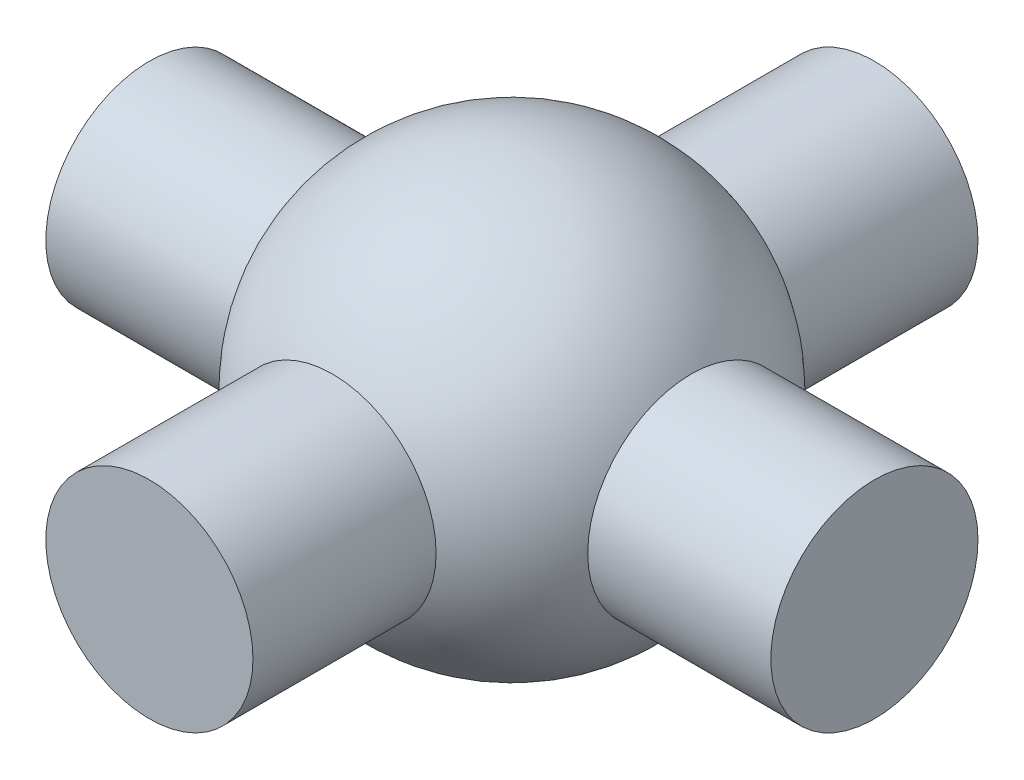
ISO-10303-21;
HEADER;
FILE_DESCRIPTION(('STEP AP214'),'2;1');
FILE_NAME('part.step','',(''),(''),'','','');
FILE_SCHEMA(('AUTOMOTIVE_DESIGN { 1 0 10303 214 1 1 1 1 }'));
ENDSEC;
DATA;
#1=APPLICATION_CONTEXT('core data for automotive mechanical design processes');
#2=APPLICATION_PROTOCOL_DEFINITION('international standard','automotive_design',2000,#1);
#3=PRODUCT_CONTEXT('',#1,'mechanical');
#4=PRODUCT('Part','Part','',(#3));
#5=PRODUCT_RELATED_PRODUCT_CATEGORY('part','',(#4));
#6=PRODUCT_DEFINITION_FORMATION('','',#4);
#7=PRODUCT_DEFINITION_CONTEXT('part definition',#1,'design');
#8=PRODUCT_DEFINITION('design','',#6,#7);
#9=PRODUCT_DEFINITION_SHAPE('','',#8);
#10=(LENGTH_UNIT() NAMED_UNIT(*) SI_UNIT(.MILLI.,.METRE.));
#11=(NAMED_UNIT(*) PLANE_ANGLE_UNIT() SI_UNIT($,.RADIAN.));
#12=(NAMED_UNIT(*) SI_UNIT($,.STERADIAN.) SOLID_ANGLE_UNIT());
#13=UNCERTAINTY_MEASURE_WITH_UNIT(LENGTH_MEASURE(1.E-05),#10,'distance_accuracy_value','');
#14=(GEOMETRIC_REPRESENTATION_CONTEXT(3) GLOBAL_UNCERTAINTY_ASSIGNED_CONTEXT((#13)) GLOBAL_UNIT_ASSIGNED_CONTEXT((#10,
#11,#12)) REPRESENTATION_CONTEXT('',''));
#15=CARTESIAN_POINT('',(0.,0.,0.));
#16=DIRECTION('',(0.,0.,1.));
#17=DIRECTION('',(1.,0.,0.));
#18=AXIS2_PLACEMENT_3D('',#15,#16,#17);
#19=CARTESIAN_POINT('',(0.,0.,0.));
#20=DIRECTION('',(0.,0.,-1.));
#21=DIRECTION('',(1.,0.,0.));
#22=AXIS2_PLACEMENT_3D('',#19,#20,#21);
#23=SPHERICAL_SURFACE('',#22,20.);
#24=CARTESIAN_POINT('',(0.,0.,17.3205080756888));
#25=DIRECTION('',(0.,0.,-1.));
#26=DIRECTION('',(-1.,0.,0.));
#27=AXIS2_PLACEMENT_3D('',#24,#25,#26);
#28=CIRCLE('',#27,10.);
#29=CARTESIAN_POINT('',(-10.,0.,17.3205080756888));
#30=VERTEX_POINT('',#29);
#31=EDGE_CURVE('E49',#30,#30,#28,.T.);
#32=ORIENTED_EDGE('',*,*,#31,.T.);
#33=EDGE_LOOP('',(#32));
#34=FACE_BOUND('',#33,.T.);
#35=CARTESIAN_POINT('',(17.3205080756888,0.,0.));
#36=DIRECTION('',(-1.,0.,0.));
#37=DIRECTION('',(0.,0.,1.));
#38=AXIS2_PLACEMENT_3D('',#35,#36,#37);
#39=CIRCLE('',#38,10.);
#40=CARTESIAN_POINT('',(17.3205080756888,0.,10.));
#41=VERTEX_POINT('',#40);
#42=EDGE_CURVE('E41',#41,#41,#39,.T.);
#43=ORIENTED_EDGE('',*,*,#42,.T.);
#44=EDGE_LOOP('',(#43));
#45=FACE_BOUND('',#44,.T.);
#46=CARTESIAN_POINT('',(-17.3205080756888,0.,0.));
#47=DIRECTION('',(1.,0.,0.));
#48=DIRECTION('',(0.,0.,-1.));
#49=AXIS2_PLACEMENT_3D('',#46,#47,#48);
#50=CIRCLE('',#49,10.);
#51=CARTESIAN_POINT('',(-17.3205080756888,0.,-10.));
#52=VERTEX_POINT('',#51);
#53=EDGE_CURVE('E10',#52,#52,#50,.T.);
#54=ORIENTED_EDGE('',*,*,#53,.T.);
#55=EDGE_LOOP('',(#54));
#56=FACE_BOUND('',#55,.T.);
#57=CARTESIAN_POINT('',(0.,0.,-17.3205080756888));
#58=DIRECTION('',(0.,0.,1.));
#59=DIRECTION('',(1.,0.,0.));
#60=AXIS2_PLACEMENT_3D('',#57,#58,#59);
#61=CIRCLE('',#60,10.);
#62=CARTESIAN_POINT('',(10.,0.,-17.3205080756888));
#63=VERTEX_POINT('',#62);
#64=EDGE_CURVE('E37',#63,#63,#61,.T.);
#65=ORIENTED_EDGE('',*,*,#64,.T.);
#66=EDGE_LOOP('',(#65));
#67=FACE_BOUND('',#66,.T.);
#68=ADVANCED_FACE('F34',(#34,#45,#56,#67),#23,.T.);
#69=CARTESIAN_POINT('',(35.,0.,0.));
#70=DIRECTION('',(-1.,0.,0.));
#71=DIRECTION('',(0.,0.,1.));
#72=AXIS2_PLACEMENT_3D('',#69,#70,#71);
#73=CYLINDRICAL_SURFACE('',#72,10.);
#74=ORIENTED_EDGE('',*,*,#53,.F.);
#75=EDGE_LOOP('',(#74));
#76=FACE_BOUND('',#75,.T.);
#77=CARTESIAN_POINT('',(-35.,0.,0.));
#78=DIRECTION('',(1.,0.,0.));
#79=DIRECTION('',(0.,0.,-1.));
#80=AXIS2_PLACEMENT_3D('',#77,#78,#79);
#81=CIRCLE('',#80,10.);
#82=CARTESIAN_POINT('',(-35.,0.,-10.));
#83=VERTEX_POINT('',#82);
#84=EDGE_CURVE('E55',#83,#83,#81,.T.);
#85=ORIENTED_EDGE('',*,*,#84,.T.);
#86=EDGE_LOOP('',(#85));
#87=FACE_BOUND('',#86,.T.);
#88=ADVANCED_FACE('F68',(#76,#87),#73,.T.);
#89=CARTESIAN_POINT('',(-35.,0.,0.));
#90=DIRECTION('',(1.,0.,0.));
#91=DIRECTION('',(0.,0.,-1.));
#92=AXIS2_PLACEMENT_3D('',#89,#90,#91);
#93=PLANE('',#92);
#94=ORIENTED_EDGE('',*,*,#84,.F.);
#95=EDGE_LOOP('',(#94));
#96=FACE_BOUND('',#95,.T.);
#97=ADVANCED_FACE('F70',(#96),#93,.F.);
#98=CARTESIAN_POINT('',(35.,0.,0.));
#99=DIRECTION('',(1.,0.,0.));
#100=DIRECTION('',(0.,0.,-1.));
#101=AXIS2_PLACEMENT_3D('',#98,#99,#100);
#102=PLANE('',#101);
#103=CARTESIAN_POINT('',(35.,0.,0.));
#104=DIRECTION('',(1.,0.,0.));
#105=DIRECTION('',(0.,0.,-1.));
#106=AXIS2_PLACEMENT_3D('',#103,#104,#105);
#107=CIRCLE('',#106,10.);
#108=CARTESIAN_POINT('',(35.,0.,-10.));
#109=VERTEX_POINT('',#108);
#110=EDGE_CURVE('E46',#109,#109,#107,.T.);
#111=ORIENTED_EDGE('',*,*,#110,.T.);
#112=EDGE_LOOP('',(#111));
#113=FACE_BOUND('',#112,.T.);
#114=ADVANCED_FACE('F72',(#113),#102,.T.);
#115=ORIENTED_EDGE('',*,*,#42,.F.);
#116=EDGE_LOOP('',(#115));
#117=FACE_BOUND('',#116,.T.);
#118=ORIENTED_EDGE('',*,*,#110,.F.);
#119=EDGE_LOOP('',(#118));
#120=FACE_BOUND('',#119,.T.);
#121=ADVANCED_FACE('F78',(#117,#120),#73,.T.);
#122=CARTESIAN_POINT('',(0.,0.,35.));
#123=DIRECTION('',(0.,0.,1.));
#124=DIRECTION('',(1.,0.,0.));
#125=AXIS2_PLACEMENT_3D('',#122,#123,#124);
#126=PLANE('',#125);
#127=CARTESIAN_POINT('',(0.,0.,35.));
#128=DIRECTION('',(0.,0.,1.));
#129=DIRECTION('',(1.,0.,0.));
#130=AXIS2_PLACEMENT_3D('',#127,#128,#129);
#131=CIRCLE('',#130,10.);
#132=CARTESIAN_POINT('',(10.,0.,35.));
#133=VERTEX_POINT('',#132);
#134=EDGE_CURVE('E51',#133,#133,#131,.T.);
#135=ORIENTED_EDGE('',*,*,#134,.T.);
#136=EDGE_LOOP('',(#135));
#137=FACE_BOUND('',#136,.T.);
#138=ADVANCED_FACE('F103',(#137),#126,.T.);
#139=CARTESIAN_POINT('',(0.,0.,35.));
#140=DIRECTION('',(0.,0.,-1.));
#141=DIRECTION('',(-1.,0.,0.));
#142=AXIS2_PLACEMENT_3D('',#139,#140,#141);
#143=CYLINDRICAL_SURFACE('',#142,10.);
#144=ORIENTED_EDGE('',*,*,#31,.F.);
#145=EDGE_LOOP('',(#144));
#146=FACE_BOUND('',#145,.T.);
#147=ORIENTED_EDGE('',*,*,#134,.F.);
#148=EDGE_LOOP('',(#147));
#149=FACE_BOUND('',#148,.T.);
#150=ADVANCED_FACE('F94',(#146,#149),#143,.T.);
#151=ORIENTED_EDGE('',*,*,#64,.F.);
#152=EDGE_LOOP('',(#151));
#153=FACE_BOUND('',#152,.T.);
#154=CARTESIAN_POINT('',(0.,0.,-35.));
#155=DIRECTION('',(0.,0.,1.));
#156=DIRECTION('',(1.,0.,0.));
#157=AXIS2_PLACEMENT_3D('',#154,#155,#156);
#158=CIRCLE('',#157,10.);
#159=CARTESIAN_POINT('',(10.,0.,-35.));
#160=VERTEX_POINT('',#159);
#161=EDGE_CURVE('E57',#160,#160,#158,.T.);
#162=ORIENTED_EDGE('',*,*,#161,.T.);
#163=EDGE_LOOP('',(#162));
#164=FACE_BOUND('',#163,.T.);
#165=ADVANCED_FACE('F90',(#153,#164),#143,.T.);
#166=CARTESIAN_POINT('',(0.,0.,-35.));
#167=DIRECTION('',(0.,0.,1.));
#168=DIRECTION('',(1.,0.,0.));
#169=AXIS2_PLACEMENT_3D('',#166,#167,#168);
#170=PLANE('',#169);
#171=ORIENTED_EDGE('',*,*,#161,.F.);
#172=EDGE_LOOP('',(#171));
#173=FACE_BOUND('',#172,.T.);
#174=ADVANCED_FACE('F93',(#173),#170,.F.);
#175=CLOSED_SHELL('',(#68,#88,#97,#114,#121,#138,#150,#165,#174));
#176=MANIFOLD_SOLID_BREP('B2',#175);
#177=ADVANCED_BREP_SHAPE_REPRESENTATION('',(#18,#176),#14);
#178=SHAPE_DEFINITION_REPRESENTATION(#9,#177);
ENDSEC;
END-ISO-10303-21;
